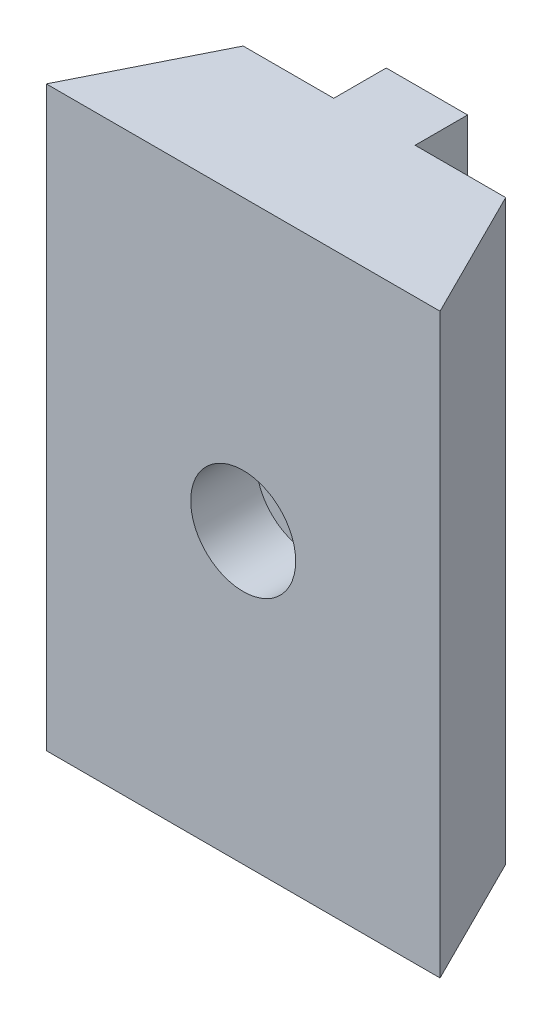
ISO-10303-21;
HEADER;
FILE_DESCRIPTION(('STEP AP214'),'2;1');
FILE_NAME('part.step','',(''),(''),'','','');
FILE_SCHEMA(('AUTOMOTIVE_DESIGN { 1 0 10303 214 1 1 1 1 }'));
ENDSEC;
DATA;
#1=APPLICATION_CONTEXT('core data for automotive mechanical design processes');
#2=APPLICATION_PROTOCOL_DEFINITION('international standard','automotive_design',2000,#1);
#3=PRODUCT_CONTEXT('',#1,'mechanical');
#4=PRODUCT('Part','Part','',(#3));
#5=PRODUCT_RELATED_PRODUCT_CATEGORY('part','',(#4));
#6=PRODUCT_DEFINITION_FORMATION('','',#4);
#7=PRODUCT_DEFINITION_CONTEXT('part definition',#1,'design');
#8=PRODUCT_DEFINITION('design','',#6,#7);
#9=PRODUCT_DEFINITION_SHAPE('','',#8);
#10=(LENGTH_UNIT() NAMED_UNIT(*) SI_UNIT(.MILLI.,.METRE.));
#11=(NAMED_UNIT(*) PLANE_ANGLE_UNIT() SI_UNIT($,.RADIAN.));
#12=(NAMED_UNIT(*) SI_UNIT($,.STERADIAN.) SOLID_ANGLE_UNIT());
#13=UNCERTAINTY_MEASURE_WITH_UNIT(LENGTH_MEASURE(1.E-05),#10,'distance_accuracy_value','');
#14=(GEOMETRIC_REPRESENTATION_CONTEXT(3) GLOBAL_UNCERTAINTY_ASSIGNED_CONTEXT((#13)) GLOBAL_UNIT_ASSIGNED_CONTEXT((#10,
#11,#12)) REPRESENTATION_CONTEXT('',''));
#15=CARTESIAN_POINT('',(0.,0.,0.));
#16=DIRECTION('',(0.,0.,1.));
#17=DIRECTION('',(1.,0.,0.));
#18=AXIS2_PLACEMENT_3D('',#15,#16,#17);
#19=CARTESIAN_POINT('',(0.,0.,0.));
#20=DIRECTION('',(0.,0.,1.));
#21=DIRECTION('',(1.,0.,0.));
#22=AXIS2_PLACEMENT_3D('',#19,#20,#21);
#23=PLANE('',#22);
#24=DIRECTION('',(0.,1.,0.));
#25=VECTOR('',#24,1.);
#26=CARTESIAN_POINT('',(3.1,-22.,0.));
#27=LINE('',#26,#25);
#28=CARTESIAN_POINT('',(3.1,3.1,0.));
#29=VERTEX_POINT('',#28);
#30=CARTESIAN_POINT('',(3.1,22.,0.));
#31=VERTEX_POINT('',#30);
#32=EDGE_CURVE('E186',#29,#31,#27,.T.);
#33=ORIENTED_EDGE('',*,*,#32,.F.);
#34=DIRECTION('',(1.,0.,0.));
#35=VECTOR('',#34,1.);
#36=CARTESIAN_POINT('',(-3.1,3.1,0.));
#37=LINE('',#36,#35);
#38=CARTESIAN_POINT('',(-3.1,3.1,0.));
#39=VERTEX_POINT('',#38);
#40=EDGE_CURVE('E164',#39,#29,#37,.T.);
#41=ORIENTED_EDGE('',*,*,#40,.F.);
#42=DIRECTION('',(0.,1.,0.));
#43=VECTOR('',#42,1.);
#44=CARTESIAN_POINT('',(-3.1,-22.,0.));
#45=LINE('',#44,#43);
#46=CARTESIAN_POINT('',(-3.1,22.,0.));
#47=VERTEX_POINT('',#46);
#48=EDGE_CURVE('E231',#39,#47,#45,.T.);
#49=ORIENTED_EDGE('',*,*,#48,.T.);
#50=DIRECTION('',(1.,0.,0.));
#51=VECTOR('',#50,1.);
#52=CARTESIAN_POINT('',(0.,22.,0.));
#53=LINE('',#52,#51);
#54=EDGE_CURVE('E70',#47,#31,#53,.T.);
#55=ORIENTED_EDGE('',*,*,#54,.T.);
#56=EDGE_LOOP('',(#33,#41,#49,#55));
#57=FACE_BOUND('',#56,.T.);
#58=ADVANCED_FACE('F66',(#57),#23,.F.);
#59=CARTESIAN_POINT('',(3.1,-22.,0.));
#60=DIRECTION('',(1.,0.,0.));
#61=DIRECTION('',(0.,0.,-1.));
#62=AXIS2_PLACEMENT_3D('',#59,#60,#61);
#63=PLANE('',#62);
#64=DIRECTION('',(0.,0.,-1.));
#65=VECTOR('',#64,1.);
#66=CARTESIAN_POINT('',(3.1,3.1,4.));
#67=LINE('',#66,#65);
#68=CARTESIAN_POINT('',(3.1,3.1,4.));
#69=VERTEX_POINT('',#68);
#70=EDGE_CURVE('E158',#69,#29,#67,.T.);
#71=ORIENTED_EDGE('',*,*,#70,.T.);
#72=ORIENTED_EDGE('',*,*,#32,.T.);
#73=DIRECTION('',(0.,0.,-1.));
#74=VECTOR('',#73,1.);
#75=CARTESIAN_POINT('',(3.1,22.,0.));
#76=LINE('',#75,#74);
#77=CARTESIAN_POINT('',(3.1,22.,4.));
#78=VERTEX_POINT('',#77);
#79=EDGE_CURVE('E181',#78,#31,#76,.T.);
#80=ORIENTED_EDGE('',*,*,#79,.F.);
#81=DIRECTION('',(0.,1.,0.));
#82=VECTOR('',#81,1.);
#83=CARTESIAN_POINT('',(3.1,-22.,4.));
#84=LINE('',#83,#82);
#85=EDGE_CURVE('E174',#69,#78,#84,.T.);
#86=ORIENTED_EDGE('',*,*,#85,.F.);
#87=EDGE_LOOP('',(#71,#72,#80,#86));
#88=FACE_BOUND('',#87,.T.);
#89=ADVANCED_FACE('F179',(#88),#63,.T.);
#90=CARTESIAN_POINT('',(-3.1,-22.,0.));
#91=DIRECTION('',(-1.,0.,0.));
#92=DIRECTION('',(0.,0.,1.));
#93=AXIS2_PLACEMENT_3D('',#90,#91,#92);
#94=PLANE('',#93);
#95=DIRECTION('',(0.,0.,-1.));
#96=VECTOR('',#95,1.);
#97=CARTESIAN_POINT('',(-3.1,3.1,4.));
#98=LINE('',#97,#96);
#99=CARTESIAN_POINT('',(-3.1,3.1,4.));
#100=VERTEX_POINT('',#99);
#101=EDGE_CURVE('E184',#100,#39,#98,.T.);
#102=ORIENTED_EDGE('',*,*,#101,.F.);
#103=DIRECTION('',(0.,1.,0.));
#104=VECTOR('',#103,1.);
#105=CARTESIAN_POINT('',(-3.1,-22.,4.));
#106=LINE('',#105,#104);
#107=CARTESIAN_POINT('',(-3.1,22.,4.));
#108=VERTEX_POINT('',#107);
#109=EDGE_CURVE('E176',#100,#108,#106,.T.);
#110=ORIENTED_EDGE('',*,*,#109,.T.);
#111=DIRECTION('',(0.,0.,1.));
#112=VECTOR('',#111,1.);
#113=CARTESIAN_POINT('',(-3.1,22.,0.));
#114=LINE('',#113,#112);
#115=EDGE_CURVE('E199',#47,#108,#114,.T.);
#116=ORIENTED_EDGE('',*,*,#115,.F.);
#117=ORIENTED_EDGE('',*,*,#48,.F.);
#118=EDGE_LOOP('',(#102,#110,#116,#117));
#119=FACE_BOUND('',#118,.T.);
#120=ADVANCED_FACE('F245',(#119),#94,.T.);
#121=CARTESIAN_POINT('',(15.,-22.,14.));
#122=DIRECTION('',(0.,-1.,0.));
#123=DIRECTION('',(1.,0.,0.));
#124=AXIS2_PLACEMENT_3D('',#121,#122,#123);
#125=PLANE('',#124);
#126=DIRECTION('',(-1.,0.,0.));
#127=VECTOR('',#126,1.);
#128=CARTESIAN_POINT('',(0.,-22.,4.));
#129=LINE('',#128,#127);
#130=CARTESIAN_POINT('',(-3.1,-22.,4.));
#131=VERTEX_POINT('',#130);
#132=CARTESIAN_POINT('',(-10.,-22.,4.));
#133=VERTEX_POINT('',#132);
#134=EDGE_CURVE('E244',#131,#133,#129,.T.);
#135=ORIENTED_EDGE('',*,*,#134,.F.);
#136=DIRECTION('',(0.,0.,1.));
#137=VECTOR('',#136,1.);
#138=CARTESIAN_POINT('',(-3.1,-22.,0.));
#139=LINE('',#138,#137);
#140=CARTESIAN_POINT('',(-3.1,-22.,0.));
#141=VERTEX_POINT('',#140);
#142=EDGE_CURVE('E255',#141,#131,#139,.T.);
#143=ORIENTED_EDGE('',*,*,#142,.F.);
#144=DIRECTION('',(-1.,0.,0.));
#145=VECTOR('',#144,1.);
#146=CARTESIAN_POINT('',(15.,-22.,0.));
#147=LINE('',#146,#145);
#148=CARTESIAN_POINT('',(3.1,-22.,0.));
#149=VERTEX_POINT('',#148);
#150=EDGE_CURVE('E213',#149,#141,#147,.T.);
#151=ORIENTED_EDGE('',*,*,#150,.F.);
#152=DIRECTION('',(0.,0.,-1.));
#153=VECTOR('',#152,1.);
#154=CARTESIAN_POINT('',(3.1,-22.,0.));
#155=LINE('',#154,#153);
#156=CARTESIAN_POINT('',(3.1,-22.,4.));
#157=VERTEX_POINT('',#156);
#158=EDGE_CURVE('E91',#157,#149,#155,.T.);
#159=ORIENTED_EDGE('',*,*,#158,.F.);
#160=DIRECTION('',(-1.,0.,0.));
#161=VECTOR('',#160,1.);
#162=CARTESIAN_POINT('',(0.,-22.,4.));
#163=LINE('',#162,#161);
#164=CARTESIAN_POINT('',(10.,-22.,4.));
#165=VERTEX_POINT('',#164);
#166=EDGE_CURVE('E195',#165,#157,#163,.T.);
#167=ORIENTED_EDGE('',*,*,#166,.F.);
#168=DIRECTION('',(0.447213595499958,0.,0.894427190999916));
#169=VECTOR('',#168,1.);
#170=CARTESIAN_POINT('',(6.4,-22.,-3.2));
#171=LINE('',#170,#169);
#172=CARTESIAN_POINT('',(15.,-22.,14.));
#173=VERTEX_POINT('',#172);
#174=EDGE_CURVE('E201',#165,#173,#171,.T.);
#175=ORIENTED_EDGE('',*,*,#174,.T.);
#176=DIRECTION('',(-1.,0.,0.));
#177=VECTOR('',#176,1.);
#178=CARTESIAN_POINT('',(15.,-22.,14.));
#179=LINE('',#178,#177);
#180=CARTESIAN_POINT('',(-15.,-22.,14.));
#181=VERTEX_POINT('',#180);
#182=EDGE_CURVE('E75',#173,#181,#179,.T.);
#183=ORIENTED_EDGE('',*,*,#182,.T.);
#184=DIRECTION('',(0.447213595499958,0.,-0.894427190999916));
#185=VECTOR('',#184,1.);
#186=CARTESIAN_POINT('',(-6.4,-22.,-3.2));
#187=LINE('',#186,#185);
#188=EDGE_CURVE('E252',#181,#133,#187,.T.);
#189=ORIENTED_EDGE('',*,*,#188,.T.);
#190=EDGE_LOOP('',(#135,#143,#151,#159,#167,#175,#183,#189));
#191=FACE_BOUND('',#190,.T.);
#192=ADVANCED_FACE('F68',(#191),#125,.T.);
#193=CARTESIAN_POINT('',(0.,22.,14.));
#194=DIRECTION('',(0.,1.,0.));
#195=DIRECTION('',(0.,0.,1.));
#196=AXIS2_PLACEMENT_3D('',#193,#194,#195);
#197=PLANE('',#196);
#198=ORIENTED_EDGE('',*,*,#54,.F.);
#199=ORIENTED_EDGE('',*,*,#115,.T.);
#200=DIRECTION('',(-1.,0.,0.));
#201=VECTOR('',#200,1.);
#202=CARTESIAN_POINT('',(0.,22.,4.));
#203=LINE('',#202,#201);
#204=CARTESIAN_POINT('',(-10.,22.,4.));
#205=VERTEX_POINT('',#204);
#206=EDGE_CURVE('E227',#108,#205,#203,.T.);
#207=ORIENTED_EDGE('',*,*,#206,.T.);
#208=DIRECTION('',(0.447213595499958,0.,-0.894427190999916));
#209=VECTOR('',#208,1.);
#210=CARTESIAN_POINT('',(-6.4,22.,-3.2));
#211=LINE('',#210,#209);
#212=CARTESIAN_POINT('',(-15.,22.,14.));
#213=VERTEX_POINT('',#212);
#214=EDGE_CURVE('E247',#213,#205,#211,.T.);
#215=ORIENTED_EDGE('',*,*,#214,.F.);
#216=DIRECTION('',(-1.,0.,0.));
#217=VECTOR('',#216,1.);
#218=CARTESIAN_POINT('',(0.,22.,14.));
#219=LINE('',#218,#217);
#220=CARTESIAN_POINT('',(15.,22.,14.));
#221=VERTEX_POINT('',#220);
#222=EDGE_CURVE('E206',#221,#213,#219,.T.);
#223=ORIENTED_EDGE('',*,*,#222,.F.);
#224=DIRECTION('',(0.447213595499958,0.,0.894427190999916));
#225=VECTOR('',#224,1.);
#226=CARTESIAN_POINT('',(6.4,22.,-3.2));
#227=LINE('',#226,#225);
#228=CARTESIAN_POINT('',(10.,22.,4.));
#229=VERTEX_POINT('',#228);
#230=EDGE_CURVE('E194',#229,#221,#227,.T.);
#231=ORIENTED_EDGE('',*,*,#230,.F.);
#232=DIRECTION('',(-1.,0.,0.));
#233=VECTOR('',#232,1.);
#234=CARTESIAN_POINT('',(0.,22.,4.));
#235=LINE('',#234,#233);
#236=EDGE_CURVE('E197',#229,#78,#235,.T.);
#237=ORIENTED_EDGE('',*,*,#236,.T.);
#238=ORIENTED_EDGE('',*,*,#79,.T.);
#239=EDGE_LOOP('',(#198,#199,#207,#215,#223,#231,#237,#238));
#240=FACE_BOUND('',#239,.T.);
#241=ADVANCED_FACE('F238',(#240),#197,.T.);
#242=CARTESIAN_POINT('',(-3.1,-3.1,0.));
#243=VERTEX_POINT('',#242);
#244=EDGE_CURVE('E230',#141,#243,#45,.T.);
#245=ORIENTED_EDGE('',*,*,#244,.T.);
#246=DIRECTION('',(-1.,0.,0.));
#247=VECTOR('',#246,1.);
#248=CARTESIAN_POINT('',(3.1,-3.1,0.));
#249=LINE('',#248,#247);
#250=CARTESIAN_POINT('',(3.1,-3.1,0.));
#251=VERTEX_POINT('',#250);
#252=EDGE_CURVE('E177',#251,#243,#249,.T.);
#253=ORIENTED_EDGE('',*,*,#252,.F.);
#254=EDGE_CURVE('E191',#149,#251,#27,.T.);
#255=ORIENTED_EDGE('',*,*,#254,.F.);
#256=ORIENTED_EDGE('',*,*,#150,.T.);
#257=EDGE_LOOP('',(#245,#253,#255,#256));
#258=FACE_BOUND('',#257,.T.);
#259=ADVANCED_FACE('F299',(#258),#23,.F.);
#260=CARTESIAN_POINT('',(0.,0.,14.));
#261=DIRECTION('',(0.,0.,1.));
#262=DIRECTION('',(1.,0.,0.));
#263=AXIS2_PLACEMENT_3D('',#260,#261,#262);
#264=PLANE('',#263);
#265=CARTESIAN_POINT('',(0.,0.,14.));
#266=DIRECTION('',(0.,0.,1.));
#267=DIRECTION('',(1.,0.,0.));
#268=AXIS2_PLACEMENT_3D('',#265,#266,#267);
#269=CIRCLE('',#268,4.);
#270=CARTESIAN_POINT('',(4.,0.,14.));
#271=VERTEX_POINT('',#270);
#272=EDGE_CURVE('E263',#271,#271,#269,.T.);
#273=ORIENTED_EDGE('',*,*,#272,.F.);
#274=EDGE_LOOP('',(#273));
#275=FACE_BOUND('',#274,.T.);
#276=ORIENTED_EDGE('',*,*,#222,.T.);
#277=DIRECTION('',(0.,-1.,0.));
#278=VECTOR('',#277,1.);
#279=CARTESIAN_POINT('',(-15.,22.,14.));
#280=LINE('',#279,#278);
#281=EDGE_CURVE('E209',#213,#181,#280,.T.);
#282=ORIENTED_EDGE('',*,*,#281,.T.);
#283=ORIENTED_EDGE('',*,*,#182,.F.);
#284=DIRECTION('',(0.,-1.,0.));
#285=VECTOR('',#284,1.);
#286=CARTESIAN_POINT('',(15.,22.,14.));
#287=LINE('',#286,#285);
#288=EDGE_CURVE('E12',#221,#173,#287,.T.);
#289=ORIENTED_EDGE('',*,*,#288,.F.);
#290=EDGE_LOOP('',(#276,#282,#283,#289));
#291=FACE_BOUND('',#290,.T.);
#292=ADVANCED_FACE('F295',(#275,#291),#264,.T.);
#293=DIRECTION('',(0.,0.,-1.));
#294=VECTOR('',#293,1.);
#295=CARTESIAN_POINT('',(3.1,-3.1,4.));
#296=LINE('',#295,#294);
#297=CARTESIAN_POINT('',(3.1,-3.1,4.));
#298=VERTEX_POINT('',#297);
#299=EDGE_CURVE('E168',#298,#251,#296,.T.);
#300=ORIENTED_EDGE('',*,*,#299,.F.);
#301=EDGE_CURVE('E183',#157,#298,#84,.T.);
#302=ORIENTED_EDGE('',*,*,#301,.F.);
#303=ORIENTED_EDGE('',*,*,#158,.T.);
#304=ORIENTED_EDGE('',*,*,#254,.T.);
#305=EDGE_LOOP('',(#300,#302,#303,#304));
#306=FACE_BOUND('',#305,.T.);
#307=ADVANCED_FACE('F298',(#306),#63,.T.);
#308=CARTESIAN_POINT('',(6.4,-22.,-3.2));
#309=DIRECTION('',(-0.894427190999916,0.,0.447213595499958));
#310=DIRECTION('',(0.447213595499958,0.,0.894427190999916));
#311=AXIS2_PLACEMENT_3D('',#308,#309,#310);
#312=PLANE('',#311);
#313=ORIENTED_EDGE('',*,*,#230,.T.);
#314=ORIENTED_EDGE('',*,*,#288,.T.);
#315=ORIENTED_EDGE('',*,*,#174,.F.);
#316=DIRECTION('',(0.,1.,0.));
#317=VECTOR('',#316,1.);
#318=CARTESIAN_POINT('',(10.,-22.,4.));
#319=LINE('',#318,#317);
#320=EDGE_CURVE('E202',#165,#229,#319,.T.);
#321=ORIENTED_EDGE('',*,*,#320,.T.);
#322=EDGE_LOOP('',(#313,#314,#315,#321));
#323=FACE_BOUND('',#322,.T.);
#324=ADVANCED_FACE('F312',(#323),#312,.F.);
#325=DIRECTION('',(0.,0.,-1.));
#326=VECTOR('',#325,1.);
#327=CARTESIAN_POINT('',(-3.1,-3.1,4.));
#328=LINE('',#327,#326);
#329=CARTESIAN_POINT('',(-3.1,-3.1,4.));
#330=VERTEX_POINT('',#329);
#331=EDGE_CURVE('E187',#330,#243,#328,.T.);
#332=ORIENTED_EDGE('',*,*,#331,.T.);
#333=ORIENTED_EDGE('',*,*,#244,.F.);
#334=ORIENTED_EDGE('',*,*,#142,.T.);
#335=EDGE_CURVE('E215',#131,#330,#106,.T.);
#336=ORIENTED_EDGE('',*,*,#335,.T.);
#337=EDGE_LOOP('',(#332,#333,#334,#336));
#338=FACE_BOUND('',#337,.T.);
#339=ADVANCED_FACE('F314',(#338),#94,.T.);
#340=CARTESIAN_POINT('',(0.,-22.,4.));
#341=DIRECTION('',(0.,0.,-1.));
#342=DIRECTION('',(-1.,0.,0.));
#343=AXIS2_PLACEMENT_3D('',#340,#341,#342);
#344=PLANE('',#343);
#345=CARTESIAN_POINT('',(0.,0.,4.));
#346=DIRECTION('',(0.,0.,1.));
#347=DIRECTION('',(1.,0.,0.));
#348=AXIS2_PLACEMENT_3D('',#345,#346,#347);
#349=CIRCLE('',#348,2.6);
#350=CARTESIAN_POINT('',(2.6,0.,4.));
#351=VERTEX_POINT('',#350);
#352=EDGE_CURVE('E266',#351,#351,#349,.T.);
#353=ORIENTED_EDGE('',*,*,#352,.T.);
#354=EDGE_LOOP('',(#353));
#355=FACE_BOUND('',#354,.T.);
#356=ORIENTED_EDGE('',*,*,#206,.F.);
#357=ORIENTED_EDGE('',*,*,#109,.F.);
#358=DIRECTION('',(1.,0.,0.));
#359=VECTOR('',#358,1.);
#360=CARTESIAN_POINT('',(-3.1,3.1,4.));
#361=LINE('',#360,#359);
#362=EDGE_CURVE('E161',#100,#69,#361,.T.);
#363=ORIENTED_EDGE('',*,*,#362,.T.);
#364=ORIENTED_EDGE('',*,*,#85,.T.);
#365=ORIENTED_EDGE('',*,*,#236,.F.);
#366=ORIENTED_EDGE('',*,*,#320,.F.);
#367=ORIENTED_EDGE('',*,*,#166,.T.);
#368=ORIENTED_EDGE('',*,*,#301,.T.);
#369=DIRECTION('',(-1.,0.,0.));
#370=VECTOR('',#369,1.);
#371=CARTESIAN_POINT('',(3.1,-3.1,4.));
#372=LINE('',#371,#370);
#373=EDGE_CURVE('E83',#298,#330,#372,.T.);
#374=ORIENTED_EDGE('',*,*,#373,.T.);
#375=ORIENTED_EDGE('',*,*,#335,.F.);
#376=ORIENTED_EDGE('',*,*,#134,.T.);
#377=DIRECTION('',(0.,1.,0.));
#378=VECTOR('',#377,1.);
#379=CARTESIAN_POINT('',(-10.,-22.,4.));
#380=LINE('',#379,#378);
#381=EDGE_CURVE('E224',#133,#205,#380,.T.);
#382=ORIENTED_EDGE('',*,*,#381,.T.);
#383=EDGE_LOOP('',(#356,#357,#363,#364,#365,#366,#367,#368,#374,#375,#376,#382));
#384=FACE_BOUND('',#383,.T.);
#385=ADVANCED_FACE('F172',(#355,#384),#344,.T.);
#386=CARTESIAN_POINT('',(-6.4,-22.,-3.2));
#387=DIRECTION('',(0.894427190999916,0.,0.447213595499958));
#388=DIRECTION('',(0.447213595499958,0.,-0.894427190999916));
#389=AXIS2_PLACEMENT_3D('',#386,#387,#388);
#390=PLANE('',#389);
#391=ORIENTED_EDGE('',*,*,#214,.T.);
#392=ORIENTED_EDGE('',*,*,#381,.F.);
#393=ORIENTED_EDGE('',*,*,#188,.F.);
#394=ORIENTED_EDGE('',*,*,#281,.F.);
#395=EDGE_LOOP('',(#391,#392,#393,#394));
#396=FACE_BOUND('',#395,.T.);
#397=ADVANCED_FACE('F307',(#396),#390,.F.);
#398=CARTESIAN_POINT('',(-3.1,3.1,4.));
#399=DIRECTION('',(0.,1.,0.));
#400=DIRECTION('',(0.,0.,1.));
#401=AXIS2_PLACEMENT_3D('',#398,#399,#400);
#402=PLANE('',#401);
#403=ORIENTED_EDGE('',*,*,#40,.T.);
#404=ORIENTED_EDGE('',*,*,#70,.F.);
#405=ORIENTED_EDGE('',*,*,#362,.F.);
#406=ORIENTED_EDGE('',*,*,#101,.T.);
#407=EDGE_LOOP('',(#403,#404,#405,#406));
#408=FACE_BOUND('',#407,.T.);
#409=ADVANCED_FACE('F160',(#408),#402,.F.);
#410=CARTESIAN_POINT('',(3.1,-3.1,4.));
#411=DIRECTION('',(0.,-1.,0.));
#412=DIRECTION('',(1.,0.,0.));
#413=AXIS2_PLACEMENT_3D('',#410,#411,#412);
#414=PLANE('',#413);
#415=ORIENTED_EDGE('',*,*,#252,.T.);
#416=ORIENTED_EDGE('',*,*,#331,.F.);
#417=ORIENTED_EDGE('',*,*,#373,.F.);
#418=ORIENTED_EDGE('',*,*,#299,.T.);
#419=EDGE_LOOP('',(#415,#416,#417,#418));
#420=FACE_BOUND('',#419,.T.);
#421=ADVANCED_FACE('F291',(#420),#414,.F.);
#422=CARTESIAN_POINT('',(0.,0.,9.));
#423=DIRECTION('',(0.,0.,1.));
#424=DIRECTION('',(1.,0.,0.));
#425=AXIS2_PLACEMENT_3D('',#422,#423,#424);
#426=CYLINDRICAL_SURFACE('',#425,4.);
#427=CARTESIAN_POINT('',(0.,0.,9.));
#428=DIRECTION('',(0.,0.,1.));
#429=DIRECTION('',(1.,0.,0.));
#430=AXIS2_PLACEMENT_3D('',#427,#428,#429);
#431=CIRCLE('',#430,4.);
#432=CARTESIAN_POINT('',(4.,0.,9.));
#433=VERTEX_POINT('',#432);
#434=EDGE_CURVE('E261',#433,#433,#431,.T.);
#435=ORIENTED_EDGE('',*,*,#434,.F.);
#436=EDGE_LOOP('',(#435));
#437=FACE_BOUND('',#436,.T.);
#438=ORIENTED_EDGE('',*,*,#272,.T.);
#439=EDGE_LOOP('',(#438));
#440=FACE_BOUND('',#439,.T.);
#441=ADVANCED_FACE('F285',(#437,#440),#426,.F.);
#442=CARTESIAN_POINT('',(0.,0.,9.));
#443=DIRECTION('',(0.,0.,1.));
#444=DIRECTION('',(1.,0.,0.));
#445=AXIS2_PLACEMENT_3D('',#442,#443,#444);
#446=PLANE('',#445);
#447=CARTESIAN_POINT('',(0.,0.,9.));
#448=DIRECTION('',(0.,0.,1.));
#449=DIRECTION('',(1.,0.,0.));
#450=AXIS2_PLACEMENT_3D('',#447,#448,#449);
#451=CIRCLE('',#450,2.6);
#452=CARTESIAN_POINT('',(2.6,0.,9.));
#453=VERTEX_POINT('',#452);
#454=EDGE_CURVE('E269',#453,#453,#451,.T.);
#455=ORIENTED_EDGE('',*,*,#454,.F.);
#456=EDGE_LOOP('',(#455));
#457=FACE_BOUND('',#456,.T.);
#458=ORIENTED_EDGE('',*,*,#434,.T.);
#459=EDGE_LOOP('',(#458));
#460=FACE_BOUND('',#459,.T.);
#461=ADVANCED_FACE('F279',(#457,#460),#446,.T.);
#462=CARTESIAN_POINT('',(0.,0.,4.));
#463=DIRECTION('',(0.,0.,1.));
#464=DIRECTION('',(1.,0.,0.));
#465=AXIS2_PLACEMENT_3D('',#462,#463,#464);
#466=CYLINDRICAL_SURFACE('',#465,2.6);
#467=ORIENTED_EDGE('',*,*,#352,.F.);
#468=EDGE_LOOP('',(#467));
#469=FACE_BOUND('',#468,.T.);
#470=ORIENTED_EDGE('',*,*,#454,.T.);
#471=EDGE_LOOP('',(#470));
#472=FACE_BOUND('',#471,.T.);
#473=ADVANCED_FACE('F276',(#469,#472),#466,.F.);
#474=CLOSED_SHELL('',(#58,#89,#120,#192,#241,#259,#292,#307,#324,#339,#385,#397,#409,#421,#441,
#461,#473));
#475=MANIFOLD_SOLID_BREP('B2',#474);
#476=ADVANCED_BREP_SHAPE_REPRESENTATION('',(#18,#475),#14);
#477=SHAPE_DEFINITION_REPRESENTATION(#9,#476);
ENDSEC;
END-ISO-10303-21;
